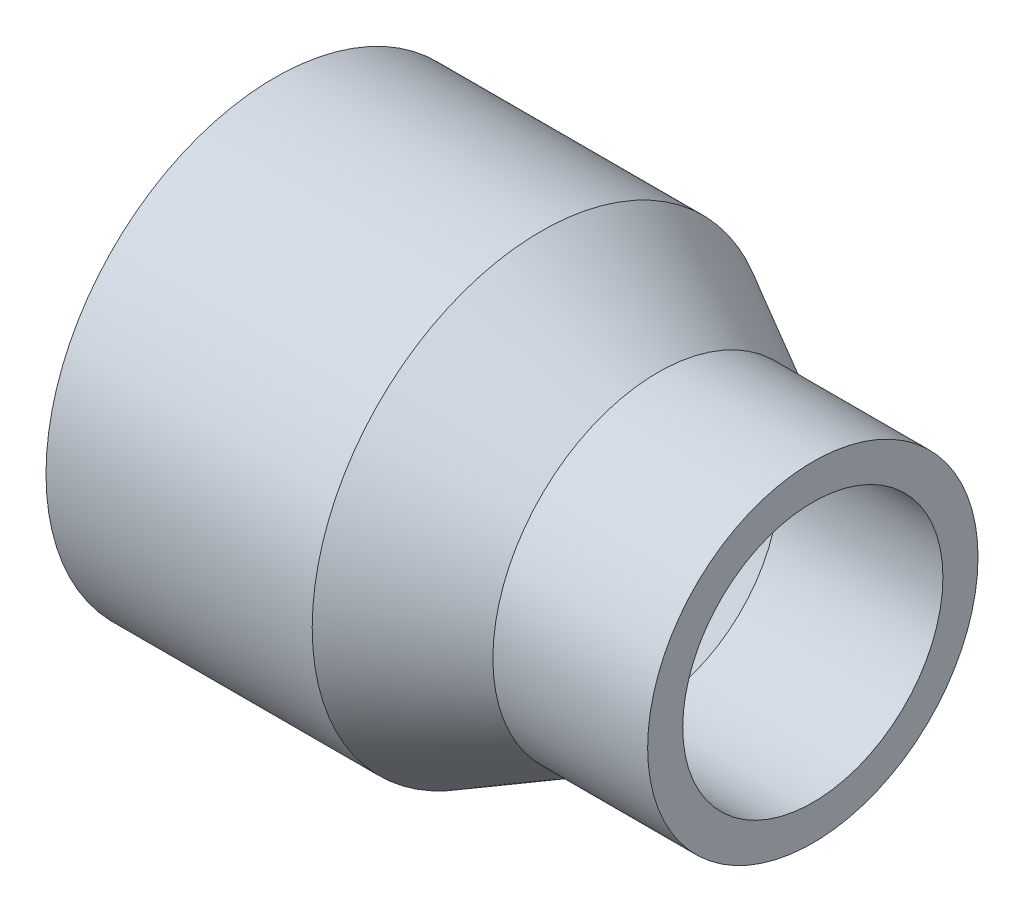
ISO-10303-21;
HEADER;
FILE_DESCRIPTION(('STEP AP214'),'2;1');
FILE_NAME('part.step','',(''),(''),'','','');
FILE_SCHEMA(('AUTOMOTIVE_DESIGN { 1 0 10303 214 1 1 1 1 }'));
ENDSEC;
DATA;
#1=APPLICATION_CONTEXT('core data for automotive mechanical design processes');
#2=APPLICATION_PROTOCOL_DEFINITION('international standard','automotive_design',2000,#1);
#3=PRODUCT_CONTEXT('',#1,'mechanical');
#4=PRODUCT('Part','Part','',(#3));
#5=PRODUCT_RELATED_PRODUCT_CATEGORY('part','',(#4));
#6=PRODUCT_DEFINITION_FORMATION('','',#4);
#7=PRODUCT_DEFINITION_CONTEXT('part definition',#1,'design');
#8=PRODUCT_DEFINITION('design','',#6,#7);
#9=PRODUCT_DEFINITION_SHAPE('','',#8);
#10=(LENGTH_UNIT() NAMED_UNIT(*) SI_UNIT(.MILLI.,.METRE.));
#11=(NAMED_UNIT(*) PLANE_ANGLE_UNIT() SI_UNIT($,.RADIAN.));
#12=(NAMED_UNIT(*) SI_UNIT($,.STERADIAN.) SOLID_ANGLE_UNIT());
#13=UNCERTAINTY_MEASURE_WITH_UNIT(LENGTH_MEASURE(1.E-05),#10,'distance_accuracy_value','');
#14=(GEOMETRIC_REPRESENTATION_CONTEXT(3) GLOBAL_UNCERTAINTY_ASSIGNED_CONTEXT((#13)) GLOBAL_UNIT_ASSIGNED_CONTEXT((#10,
#11,#12)) REPRESENTATION_CONTEXT('',''));
#15=CARTESIAN_POINT('',(0.,0.,0.));
#16=DIRECTION('',(0.,0.,1.));
#17=DIRECTION('',(1.,0.,0.));
#18=AXIS2_PLACEMENT_3D('',#15,#16,#17);
#19=CARTESIAN_POINT('',(0.,0.,-19.575));
#20=DIRECTION('',(1.,0.,0.));
#21=DIRECTION('',(0.,0.,-1.));
#22=AXIS2_PLACEMENT_3D('',#19,#20,#21);
#23=PLANE('',#22);
#24=CARTESIAN_POINT('',(0.,0.,0.));
#25=DIRECTION('',(-1.,0.,0.));
#26=DIRECTION('',(0.,0.,1.));
#27=AXIS2_PLACEMENT_3D('',#24,#25,#26);
#28=CIRCLE('',#27,16.575);
#29=CARTESIAN_POINT('',(0.,0.,16.575));
#30=VERTEX_POINT('',#29);
#31=EDGE_CURVE('E10',#30,#30,#28,.T.);
#32=ORIENTED_EDGE('',*,*,#31,.F.);
#33=EDGE_LOOP('',(#32));
#34=FACE_BOUND('',#33,.T.);
#35=CARTESIAN_POINT('',(0.,0.,0.));
#36=DIRECTION('',(-1.,0.,0.));
#37=DIRECTION('',(0.,0.,1.));
#38=AXIS2_PLACEMENT_3D('',#35,#36,#37);
#39=CIRCLE('',#38,17.1);
#40=CARTESIAN_POINT('',(0.,0.,17.1));
#41=VERTEX_POINT('',#40);
#42=EDGE_CURVE('E65',#41,#41,#39,.T.);
#43=ORIENTED_EDGE('',*,*,#42,.T.);
#44=EDGE_LOOP('',(#43));
#45=FACE_BOUND('',#44,.T.);
#46=ADVANCED_FACE('F33',(#34,#45),#23,.F.);
#47=CARTESIAN_POINT('',(0.,0.,0.));
#48=DIRECTION('',(-1.,0.,0.));
#49=DIRECTION('',(0.,0.,1.));
#50=AXIS2_PLACEMENT_3D('',#47,#48,#49);
#51=CYLINDRICAL_SURFACE('',#50,16.575);
#52=CARTESIAN_POINT('',(12.,0.,0.));
#53=DIRECTION('',(-1.,0.,0.));
#54=DIRECTION('',(0.,0.,1.));
#55=AXIS2_PLACEMENT_3D('',#52,#53,#54);
#56=CIRCLE('',#55,16.575);
#57=CARTESIAN_POINT('',(12.,0.,16.575));
#58=VERTEX_POINT('',#57);
#59=EDGE_CURVE('E39',#58,#58,#56,.T.);
#60=ORIENTED_EDGE('',*,*,#59,.F.);
#61=EDGE_LOOP('',(#60));
#62=FACE_BOUND('',#61,.T.);
#63=ORIENTED_EDGE('',*,*,#31,.T.);
#64=EDGE_LOOP('',(#63));
#65=FACE_BOUND('',#64,.T.);
#66=ADVANCED_FACE('F88',(#62,#65),#51,.F.);
#67=CARTESIAN_POINT('',(12.,0.,0.));
#68=DIRECTION('',(-1.,0.,0.));
#69=DIRECTION('',(0.,0.,1.));
#70=AXIS2_PLACEMENT_3D('',#67,#68,#69);
#71=CONICAL_SURFACE('',#70,16.575,0.498996336270503);
#72=CARTESIAN_POINT('',(22.,0.,0.));
#73=DIRECTION('',(-1.,0.,0.));
#74=DIRECTION('',(0.,0.,1.));
#75=AXIS2_PLACEMENT_3D('',#72,#73,#74);
#76=CIRCLE('',#75,11.125);
#77=CARTESIAN_POINT('',(22.,0.,11.125));
#78=VERTEX_POINT('',#77);
#79=EDGE_CURVE('E43',#78,#78,#76,.T.);
#80=ORIENTED_EDGE('',*,*,#79,.F.);
#81=EDGE_LOOP('',(#80));
#82=FACE_BOUND('',#81,.T.);
#83=ORIENTED_EDGE('',*,*,#59,.T.);
#84=EDGE_LOOP('',(#83));
#85=FACE_BOUND('',#84,.T.);
#86=ADVANCED_FACE('F93',(#82,#85),#71,.F.);
#87=CARTESIAN_POINT('',(0.,0.,0.));
#88=DIRECTION('',(-1.,0.,0.));
#89=DIRECTION('',(0.,0.,1.));
#90=AXIS2_PLACEMENT_3D('',#87,#88,#89);
#91=CYLINDRICAL_SURFACE('',#90,11.125);
#92=CARTESIAN_POINT('',(36.,0.,0.));
#93=DIRECTION('',(-1.,0.,0.));
#94=DIRECTION('',(0.,0.,1.));
#95=AXIS2_PLACEMENT_3D('',#92,#93,#94);
#96=CIRCLE('',#95,11.125);
#97=CARTESIAN_POINT('',(36.,0.,11.125));
#98=VERTEX_POINT('',#97);
#99=EDGE_CURVE('E47',#98,#98,#96,.T.);
#100=ORIENTED_EDGE('',*,*,#99,.F.);
#101=EDGE_LOOP('',(#100));
#102=FACE_BOUND('',#101,.T.);
#103=ORIENTED_EDGE('',*,*,#79,.T.);
#104=EDGE_LOOP('',(#103));
#105=FACE_BOUND('',#104,.T.);
#106=ADVANCED_FACE('F100',(#102,#105),#91,.F.);
#107=CARTESIAN_POINT('',(36.,0.,-14.125));
#108=DIRECTION('',(-1.,0.,0.));
#109=DIRECTION('',(0.,0.,1.));
#110=AXIS2_PLACEMENT_3D('',#107,#108,#109);
#111=PLANE('',#110);
#112=CARTESIAN_POINT('',(36.,0.,0.));
#113=DIRECTION('',(-1.,0.,0.));
#114=DIRECTION('',(0.,0.,1.));
#115=AXIS2_PLACEMENT_3D('',#112,#113,#114);
#116=CIRCLE('',#115,14.125);
#117=CARTESIAN_POINT('',(36.,0.,14.125));
#118=VERTEX_POINT('',#117);
#119=EDGE_CURVE('E52',#118,#118,#116,.T.);
#120=ORIENTED_EDGE('',*,*,#119,.F.);
#121=EDGE_LOOP('',(#120));
#122=FACE_BOUND('',#121,.T.);
#123=ORIENTED_EDGE('',*,*,#99,.T.);
#124=EDGE_LOOP('',(#123));
#125=FACE_BOUND('',#124,.T.);
#126=ADVANCED_FACE('F106',(#122,#125),#111,.F.);
#127=CARTESIAN_POINT('',(0.,0.,0.));
#128=DIRECTION('',(-1.,0.,0.));
#129=DIRECTION('',(0.,0.,1.));
#130=AXIS2_PLACEMENT_3D('',#127,#128,#129);
#131=CYLINDRICAL_SURFACE('',#130,14.125);
#132=CARTESIAN_POINT('',(22.7644223158429,0.,0.));
#133=DIRECTION('',(-1.,0.,0.));
#134=DIRECTION('',(0.,0.,1.));
#135=AXIS2_PLACEMENT_3D('',#132,#133,#134);
#136=CIRCLE('',#135,14.125);
#137=CARTESIAN_POINT('',(22.7644223158429,0.,14.125));
#138=VERTEX_POINT('',#137);
#139=EDGE_CURVE('E55',#138,#138,#136,.T.);
#140=ORIENTED_EDGE('',*,*,#139,.F.);
#141=EDGE_LOOP('',(#140));
#142=FACE_BOUND('',#141,.T.);
#143=ORIENTED_EDGE('',*,*,#119,.T.);
#144=EDGE_LOOP('',(#143));
#145=FACE_BOUND('',#144,.T.);
#146=ADVANCED_FACE('F110',(#142,#145),#131,.T.);
#147=CARTESIAN_POINT('',(22.7644223158429,0.,0.));
#148=DIRECTION('',(-1.,0.,0.));
#149=DIRECTION('',(0.,0.,1.));
#150=AXIS2_PLACEMENT_3D('',#147,#148,#149);
#151=CONICAL_SURFACE('',#150,14.125,0.498996336270503);
#152=CARTESIAN_POINT('',(12.7644223158429,0.,0.));
#153=DIRECTION('',(-1.,0.,0.));
#154=DIRECTION('',(0.,0.,1.));
#155=AXIS2_PLACEMENT_3D('',#152,#153,#154);
#156=CIRCLE('',#155,19.575);
#157=CARTESIAN_POINT('',(12.7644223158429,0.,19.575));
#158=VERTEX_POINT('',#157);
#159=EDGE_CURVE('E58',#158,#158,#156,.T.);
#160=ORIENTED_EDGE('',*,*,#159,.F.);
#161=EDGE_LOOP('',(#160));
#162=FACE_BOUND('',#161,.T.);
#163=ORIENTED_EDGE('',*,*,#139,.T.);
#164=EDGE_LOOP('',(#163));
#165=FACE_BOUND('',#164,.T.);
#166=ADVANCED_FACE('F84',(#162,#165),#151,.T.);
#167=CARTESIAN_POINT('',(0.,0.,0.));
#168=DIRECTION('',(-1.,0.,0.));
#169=DIRECTION('',(0.,0.,1.));
#170=AXIS2_PLACEMENT_3D('',#167,#168,#169);
#171=CYLINDRICAL_SURFACE('',#170,19.575);
#172=ORIENTED_EDGE('',*,*,#159,.T.);
#173=EDGE_LOOP('',(#172));
#174=FACE_BOUND('',#173,.T.);
#175=CARTESIAN_POINT('',(-10.,0.,0.));
#176=DIRECTION('',(-1.,0.,0.));
#177=DIRECTION('',(0.,0.,1.));
#178=AXIS2_PLACEMENT_3D('',#175,#176,#177);
#179=CIRCLE('',#178,19.575);
#180=CARTESIAN_POINT('',(-10.,0.,19.575));
#181=VERTEX_POINT('',#180);
#182=EDGE_CURVE('E61',#181,#181,#179,.T.);
#183=ORIENTED_EDGE('',*,*,#182,.F.);
#184=EDGE_LOOP('',(#183));
#185=FACE_BOUND('',#184,.T.);
#186=ADVANCED_FACE('F76',(#174,#185),#171,.T.);
#187=CARTESIAN_POINT('',(-10.,0.,0.));
#188=DIRECTION('',(-1.,0.,0.));
#189=DIRECTION('',(0.,0.,1.));
#190=AXIS2_PLACEMENT_3D('',#187,#188,#189);
#191=PLANE('',#190);
#192=ORIENTED_EDGE('',*,*,#182,.T.);
#193=EDGE_LOOP('',(#192));
#194=FACE_BOUND('',#193,.T.);
#195=CARTESIAN_POINT('',(-10.,0.,0.));
#196=DIRECTION('',(-1.,0.,0.));
#197=DIRECTION('',(0.,0.,1.));
#198=AXIS2_PLACEMENT_3D('',#195,#196,#197);
#199=CIRCLE('',#198,17.1);
#200=CARTESIAN_POINT('',(-10.,0.,17.1));
#201=VERTEX_POINT('',#200);
#202=EDGE_CURVE('E64',#201,#201,#199,.T.);
#203=ORIENTED_EDGE('',*,*,#202,.F.);
#204=EDGE_LOOP('',(#203));
#205=FACE_BOUND('',#204,.T.);
#206=ADVANCED_FACE('F74',(#194,#205),#191,.T.);
#207=CARTESIAN_POINT('',(-10.,0.,0.));
#208=DIRECTION('',(1.,0.,0.));
#209=DIRECTION('',(0.,0.,-1.));
#210=AXIS2_PLACEMENT_3D('',#207,#208,#209);
#211=CYLINDRICAL_SURFACE('',#210,17.1);
#212=ORIENTED_EDGE('',*,*,#202,.T.);
#213=EDGE_LOOP('',(#212));
#214=FACE_BOUND('',#213,.T.);
#215=ORIENTED_EDGE('',*,*,#42,.F.);
#216=EDGE_LOOP('',(#215));
#217=FACE_BOUND('',#216,.T.);
#218=ADVANCED_FACE('F71',(#214,#217),#211,.F.);
#219=CLOSED_SHELL('',(#46,#66,#86,#106,#126,#146,#166,#186,#206,#218));
#220=MANIFOLD_SOLID_BREP('B2',#219);
#221=ADVANCED_BREP_SHAPE_REPRESENTATION('',(#18,#220),#14);
#222=SHAPE_DEFINITION_REPRESENTATION(#9,#221);
ENDSEC;
END-ISO-10303-21;
